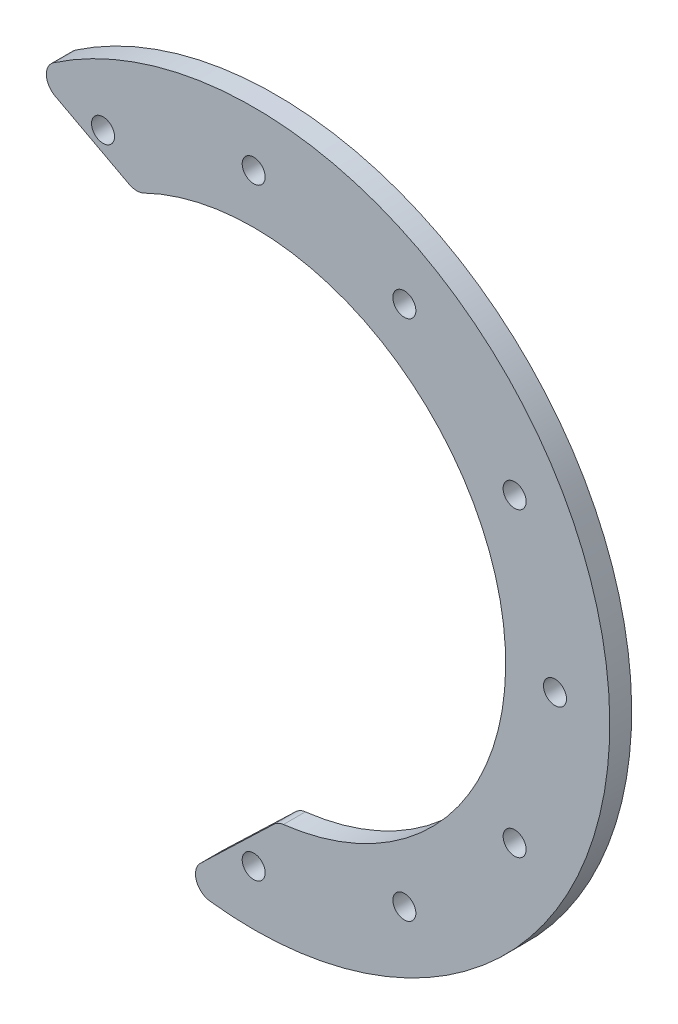
ISO-10303-21;
HEADER;
FILE_DESCRIPTION(('STEP AP214'),'2;1');
FILE_NAME('part.step','',(''),(''),'','','');
FILE_SCHEMA(('AUTOMOTIVE_DESIGN { 1 0 10303 214 1 1 1 1 }'));
ENDSEC;
DATA;
#1=APPLICATION_CONTEXT('core data for automotive mechanical design processes');
#2=APPLICATION_PROTOCOL_DEFINITION('international standard','automotive_design',2000,#1);
#3=PRODUCT_CONTEXT('',#1,'mechanical');
#4=PRODUCT('Part','Part','',(#3));
#5=PRODUCT_RELATED_PRODUCT_CATEGORY('part','',(#4));
#6=PRODUCT_DEFINITION_FORMATION('','',#4);
#7=PRODUCT_DEFINITION_CONTEXT('part definition',#1,'design');
#8=PRODUCT_DEFINITION('design','',#6,#7);
#9=PRODUCT_DEFINITION_SHAPE('','',#8);
#10=(LENGTH_UNIT() NAMED_UNIT(*) SI_UNIT(.MILLI.,.METRE.));
#11=(NAMED_UNIT(*) PLANE_ANGLE_UNIT() SI_UNIT($,.RADIAN.));
#12=(NAMED_UNIT(*) SI_UNIT($,.STERADIAN.) SOLID_ANGLE_UNIT());
#13=UNCERTAINTY_MEASURE_WITH_UNIT(LENGTH_MEASURE(1.E-05),#10,'distance_accuracy_value','');
#14=(GEOMETRIC_REPRESENTATION_CONTEXT(3) GLOBAL_UNCERTAINTY_ASSIGNED_CONTEXT((#13)) GLOBAL_UNIT_ASSIGNED_CONTEXT((#10,
#11,#12)) REPRESENTATION_CONTEXT('',''));
#15=CARTESIAN_POINT('',(0.,0.,0.));
#16=DIRECTION('',(0.,0.,1.));
#17=DIRECTION('',(1.,0.,0.));
#18=AXIS2_PLACEMENT_3D('',#15,#16,#17);
#19=CARTESIAN_POINT('',(0.,0.,4.));
#20=DIRECTION('',(0.,0.,1.));
#21=DIRECTION('',(1.,0.,0.));
#22=AXIS2_PLACEMENT_3D('',#19,#20,#21);
#23=PLANE('',#22);
#24=DIRECTION('',(0.721506911525275,0.692407233224249,0.));
#25=VECTOR('',#24,1.);
#26=CARTESIAN_POINT('',(-37.6609541251066,-86.1951963747823,4.));
#27=LINE('',#26,#25);
#28=CARTESIAN_POINT('',(-9.70289224313838,-59.3647336795849,4.));
#29=VERTEX_POINT('',#28);
#30=CARTESIAN_POINT('',(3.71033659998461,-46.4924846082118,4.));
#31=VERTEX_POINT('',#30);
#32=EDGE_CURVE('E154',#29,#31,#27,.T.);
#33=ORIENTED_EDGE('',*,*,#32,.F.);
#34=CARTESIAN_POINT('',(-7.62567054346563,-61.5292544141607,4.));
#35=DIRECTION('',(0.,0.,1.));
#36=DIRECTION('',(1.,0.,0.));
#37=AXIS2_PLACEMENT_3D('',#34,#35,#36);
#38=CIRCLE('',#37,3.);
#39=CARTESIAN_POINT('',(-7.99465460202043,-64.5064764019427,4.));
#40=VERTEX_POINT('',#39);
#41=EDGE_CURVE('E42',#29,#40,#38,.T.);
#42=ORIENTED_EDGE('',*,*,#41,.T.);
#43=CARTESIAN_POINT('',(0.,0.,4.));
#44=DIRECTION('',(0.,0.,1.));
#45=DIRECTION('',(1.,0.,0.));
#46=AXIS2_PLACEMENT_3D('',#43,#44,#45);
#47=CIRCLE('',#46,65.);
#48=CARTESIAN_POINT('',(-36.5315235416139,53.7628848531076,4.));
#49=VERTEX_POINT('',#48);
#50=EDGE_CURVE('E127',#40,#49,#47,.T.);
#51=ORIENTED_EDGE('',*,*,#50,.T.);
#52=CARTESIAN_POINT('',(-34.8454532243087,51.2815209368103,4.));
#53=DIRECTION('',(0.,0.,1.));
#54=DIRECTION('',(1.,0.,0.));
#55=AXIS2_PLACEMENT_3D('',#52,#53,#54);
#56=CIRCLE('',#55,3.);
#57=CARTESIAN_POINT('',(-36.2538679126663,48.6326781582336,4.));
#58=VERTEX_POINT('',#57);
#59=EDGE_CURVE('E118',#49,#58,#56,.T.);
#60=ORIENTED_EDGE('',*,*,#59,.T.);
#61=DIRECTION('',(-0.88294759285893,0.469471562785885,0.));
#62=VECTOR('',#61,1.);
#63=CARTESIAN_POINT('',(-40.4623789932553,50.8703831930345,4.));
#64=LINE('',#63,#62);
#65=CARTESIAN_POINT('',(-22.7567462914778,41.4561312919657,4.));
#66=VERTEX_POINT('',#65);
#67=EDGE_CURVE('E168',#66,#58,#64,.T.);
#68=ORIENTED_EDGE('',*,*,#67,.F.);
#69=CARTESIAN_POINT('',(-21.3483316031201,44.1049740705425,4.));
#70=DIRECTION('',(0.,0.,1.));
#71=DIRECTION('',(1.,0.,0.));
#72=AXIS2_PLACEMENT_3D('',#69,#70,#71);
#73=CIRCLE('',#72,3.);
#74=CARTESIAN_POINT('',(-20.041290892725,41.4046695356113,4.));
#75=VERTEX_POINT('',#74);
#76=EDGE_CURVE('E132',#66,#75,#73,.T.);
#77=ORIENTED_EDGE('',*,*,#76,.T.);
#78=CARTESIAN_POINT('',(0.,0.,4.));
#79=DIRECTION('',(0.,0.,1.));
#80=DIRECTION('',(1.,0.,0.));
#81=AXIS2_PLACEMENT_3D('',#78,#79,#80);
#82=CIRCLE('',#81,46.);
#83=CARTESIAN_POINT('',(5.43321799559669,-45.6780050156782,4.));
#84=VERTEX_POINT('',#83);
#85=EDGE_CURVE('E110',#84,#75,#82,.T.);
#86=ORIENTED_EDGE('',*,*,#85,.F.);
#87=CARTESIAN_POINT('',(5.78755829965734,-48.6570053427877,4.));
#88=DIRECTION('',(0.,0.,1.));
#89=DIRECTION('',(1.,0.,0.));
#90=AXIS2_PLACEMENT_3D('',#87,#88,#89);
#91=CIRCLE('',#90,3.);
#92=EDGE_CURVE('E49',#84,#31,#91,.T.);
#93=ORIENTED_EDGE('',*,*,#92,.T.);
#94=EDGE_LOOP('',(#33,#42,#51,#60,#68,#77,#86,#93));
#95=FACE_BOUND('',#94,.T.);
#96=CARTESIAN_POINT('',(0.,55.,4.));
#97=DIRECTION('',(0.,0.,1.));
#98=DIRECTION('',(1.,0.,0.));
#99=AXIS2_PLACEMENT_3D('',#96,#97,#98);
#100=CIRCLE('',#99,2.1);
#101=CARTESIAN_POINT('',(2.1,55.,4.));
#102=VERTEX_POINT('',#101);
#103=EDGE_CURVE('E179',#102,#102,#100,.T.);
#104=ORIENTED_EDGE('',*,*,#103,.F.);
#105=EDGE_LOOP('',(#104));
#106=FACE_BOUND('',#105,.T.);
#107=CARTESIAN_POINT('',(-27.4999999999997,47.6313972081429,4.));
#108=DIRECTION('',(0.,0.,1.));
#109=DIRECTION('',(1.,0.,0.));
#110=AXIS2_PLACEMENT_3D('',#107,#108,#109);
#111=CIRCLE('',#110,2.10000000000135);
#112=CARTESIAN_POINT('',(-25.3999999999984,47.6313972081429,4.));
#113=VERTEX_POINT('',#112);
#114=EDGE_CURVE('E175',#113,#113,#111,.T.);
#115=ORIENTED_EDGE('',*,*,#114,.F.);
#116=EDGE_LOOP('',(#115));
#117=FACE_BOUND('',#116,.T.);
#118=CARTESIAN_POINT('',(27.5000000000001,47.6313972081441,4.));
#119=DIRECTION('',(0.,0.,1.));
#120=DIRECTION('',(1.,0.,0.));
#121=AXIS2_PLACEMENT_3D('',#118,#119,#120);
#122=CIRCLE('',#121,2.1);
#123=CARTESIAN_POINT('',(29.6000000000001,47.6313972081441,4.));
#124=VERTEX_POINT('',#123);
#125=EDGE_CURVE('E203',#124,#124,#122,.T.);
#126=ORIENTED_EDGE('',*,*,#125,.F.);
#127=EDGE_LOOP('',(#126));
#128=FACE_BOUND('',#127,.T.);
#129=CARTESIAN_POINT('',(47.6313972081453,27.500000000002,4.));
#130=DIRECTION('',(0.,0.,1.));
#131=DIRECTION('',(1.,0.,0.));
#132=AXIS2_PLACEMENT_3D('',#129,#130,#131);
#133=CIRCLE('',#132,2.10000000000065);
#134=CARTESIAN_POINT('',(49.7313972081459,27.500000000002,4.));
#135=VERTEX_POINT('',#134);
#136=EDGE_CURVE('E209',#135,#135,#133,.T.);
#137=ORIENTED_EDGE('',*,*,#136,.F.);
#138=EDGE_LOOP('',(#137));
#139=FACE_BOUND('',#138,.T.);
#140=CARTESIAN_POINT('',(55.0000000000023,2.33468769191537E-12,4.));
#141=DIRECTION('',(0.,0.,1.));
#142=DIRECTION('',(1.,0.,0.));
#143=AXIS2_PLACEMENT_3D('',#140,#141,#142);
#144=CIRCLE('',#143,2.10000000000173);
#145=CARTESIAN_POINT('',(57.1000000000041,2.33468769191537E-12,4.));
#146=VERTEX_POINT('',#145);
#147=EDGE_CURVE('E215',#146,#146,#144,.T.);
#148=ORIENTED_EDGE('',*,*,#147,.F.);
#149=EDGE_LOOP('',(#148));
#150=FACE_BOUND('',#149,.T.);
#151=CARTESIAN_POINT('',(47.6313972081476,-27.499999999998,4.));
#152=DIRECTION('',(0.,0.,1.));
#153=DIRECTION('',(1.,0.,0.));
#154=AXIS2_PLACEMENT_3D('',#151,#152,#153);
#155=CIRCLE('',#154,2.10000000000301);
#156=CARTESIAN_POINT('',(49.7313972081506,-27.499999999998,4.));
#157=VERTEX_POINT('',#156);
#158=EDGE_CURVE('E192',#157,#157,#155,.T.);
#159=ORIENTED_EDGE('',*,*,#158,.F.);
#160=EDGE_LOOP('',(#159));
#161=FACE_BOUND('',#160,.T.);
#162=CARTESIAN_POINT('',(27.5000000000044,-47.6313972081429,4.));
#163=DIRECTION('',(0.,0.,1.));
#164=DIRECTION('',(1.,0.,0.));
#165=AXIS2_PLACEMENT_3D('',#162,#163,#164);
#166=CIRCLE('',#165,2.10000000000414);
#167=CARTESIAN_POINT('',(29.6000000000085,-47.6313972081429,4.));
#168=VERTEX_POINT('',#167);
#169=EDGE_CURVE('E193',#168,#168,#166,.T.);
#170=ORIENTED_EDGE('',*,*,#169,.F.);
#171=EDGE_LOOP('',(#170));
#172=FACE_BOUND('',#171,.T.);
#173=CARTESIAN_POINT('',(4.66937538383073E-12,-55.,4.));
#174=DIRECTION('',(0.,0.,1.));
#175=DIRECTION('',(1.,0.,0.));
#176=AXIS2_PLACEMENT_3D('',#173,#174,#175);
#177=CIRCLE('',#176,2.10000000000483);
#178=CARTESIAN_POINT('',(2.1000000000095,-55.,4.));
#179=VERTEX_POINT('',#178);
#180=EDGE_CURVE('E186',#179,#179,#177,.T.);
#181=ORIENTED_EDGE('',*,*,#180,.F.);
#182=EDGE_LOOP('',(#181));
#183=FACE_BOUND('',#182,.T.);
#184=ADVANCED_FACE('F34',(#95,#106,#117,#128,#139,#150,#161,#172,#183),#23,.T.);
#185=CARTESIAN_POINT('',(0.,0.,0.));
#186=DIRECTION('',(0.,0.,1.));
#187=DIRECTION('',(1.,0.,0.));
#188=AXIS2_PLACEMENT_3D('',#185,#186,#187);
#189=PLANE('',#188);
#190=CARTESIAN_POINT('',(0.,55.,0.));
#191=DIRECTION('',(0.,0.,1.));
#192=DIRECTION('',(1.,0.,0.));
#193=AXIS2_PLACEMENT_3D('',#190,#191,#192);
#194=CIRCLE('',#193,2.1);
#195=CARTESIAN_POINT('',(2.1,55.,0.));
#196=VERTEX_POINT('',#195);
#197=EDGE_CURVE('E111',#196,#196,#194,.T.);
#198=ORIENTED_EDGE('',*,*,#197,.T.);
#199=EDGE_LOOP('',(#198));
#200=FACE_BOUND('',#199,.T.);
#201=CARTESIAN_POINT('',(-27.4999999999997,47.6313972081429,0.));
#202=DIRECTION('',(0.,0.,1.));
#203=DIRECTION('',(1.,0.,0.));
#204=AXIS2_PLACEMENT_3D('',#201,#202,#203);
#205=CIRCLE('',#204,2.10000000000135);
#206=CARTESIAN_POINT('',(-25.3999999999984,47.6313972081429,0.));
#207=VERTEX_POINT('',#206);
#208=EDGE_CURVE('E183',#207,#207,#205,.T.);
#209=ORIENTED_EDGE('',*,*,#208,.T.);
#210=EDGE_LOOP('',(#209));
#211=FACE_BOUND('',#210,.T.);
#212=CARTESIAN_POINT('',(27.5000000000001,47.6313972081441,0.));
#213=DIRECTION('',(0.,0.,1.));
#214=DIRECTION('',(1.,0.,0.));
#215=AXIS2_PLACEMENT_3D('',#212,#213,#214);
#216=CIRCLE('',#215,2.1);
#217=CARTESIAN_POINT('',(29.6000000000001,47.6313972081441,0.));
#218=VERTEX_POINT('',#217);
#219=EDGE_CURVE('E182',#218,#218,#216,.T.);
#220=ORIENTED_EDGE('',*,*,#219,.T.);
#221=EDGE_LOOP('',(#220));
#222=FACE_BOUND('',#221,.T.);
#223=CARTESIAN_POINT('',(47.6313972081453,27.500000000002,0.));
#224=DIRECTION('',(0.,0.,1.));
#225=DIRECTION('',(1.,0.,0.));
#226=AXIS2_PLACEMENT_3D('',#223,#224,#225);
#227=CIRCLE('',#226,2.10000000000065);
#228=CARTESIAN_POINT('',(49.7313972081459,27.500000000002,0.));
#229=VERTEX_POINT('',#228);
#230=EDGE_CURVE('E206',#229,#229,#227,.T.);
#231=ORIENTED_EDGE('',*,*,#230,.T.);
#232=EDGE_LOOP('',(#231));
#233=FACE_BOUND('',#232,.T.);
#234=CARTESIAN_POINT('',(55.0000000000023,2.33468769191537E-12,0.));
#235=DIRECTION('',(0.,0.,1.));
#236=DIRECTION('',(1.,0.,0.));
#237=AXIS2_PLACEMENT_3D('',#234,#235,#236);
#238=CIRCLE('',#237,2.10000000000173);
#239=CARTESIAN_POINT('',(57.1000000000041,2.33468769191537E-12,0.));
#240=VERTEX_POINT('',#239);
#241=EDGE_CURVE('E212',#240,#240,#238,.T.);
#242=ORIENTED_EDGE('',*,*,#241,.T.);
#243=EDGE_LOOP('',(#242));
#244=FACE_BOUND('',#243,.T.);
#245=CARTESIAN_POINT('',(47.6313972081476,-27.499999999998,0.));
#246=DIRECTION('',(0.,0.,1.));
#247=DIRECTION('',(1.,0.,0.));
#248=AXIS2_PLACEMENT_3D('',#245,#246,#247);
#249=CIRCLE('',#248,2.10000000000301);
#250=CARTESIAN_POINT('',(49.7313972081506,-27.499999999998,0.));
#251=VERTEX_POINT('',#250);
#252=EDGE_CURVE('E218',#251,#251,#249,.T.);
#253=ORIENTED_EDGE('',*,*,#252,.T.);
#254=EDGE_LOOP('',(#253));
#255=FACE_BOUND('',#254,.T.);
#256=CARTESIAN_POINT('',(27.5000000000044,-47.6313972081429,0.));
#257=DIRECTION('',(0.,0.,1.));
#258=DIRECTION('',(1.,0.,0.));
#259=AXIS2_PLACEMENT_3D('',#256,#257,#258);
#260=CIRCLE('',#259,2.10000000000414);
#261=CARTESIAN_POINT('',(29.6000000000085,-47.6313972081429,0.));
#262=VERTEX_POINT('',#261);
#263=EDGE_CURVE('E189',#262,#262,#260,.T.);
#264=ORIENTED_EDGE('',*,*,#263,.T.);
#265=EDGE_LOOP('',(#264));
#266=FACE_BOUND('',#265,.T.);
#267=CARTESIAN_POINT('',(4.66937538383073E-12,-55.,0.));
#268=DIRECTION('',(0.,0.,1.));
#269=DIRECTION('',(1.,0.,0.));
#270=AXIS2_PLACEMENT_3D('',#267,#268,#269);
#271=CIRCLE('',#270,2.10000000000483);
#272=CARTESIAN_POINT('',(2.1000000000095,-55.,0.));
#273=VERTEX_POINT('',#272);
#274=EDGE_CURVE('E196',#273,#273,#271,.T.);
#275=ORIENTED_EDGE('',*,*,#274,.T.);
#276=EDGE_LOOP('',(#275));
#277=FACE_BOUND('',#276,.T.);
#278=CARTESIAN_POINT('',(0.,0.,0.));
#279=DIRECTION('',(0.,0.,1.));
#280=DIRECTION('',(1.,0.,0.));
#281=AXIS2_PLACEMENT_3D('',#278,#279,#280);
#282=CIRCLE('',#281,65.);
#283=CARTESIAN_POINT('',(-7.99465460202043,-64.5064764019427,0.));
#284=VERTEX_POINT('',#283);
#285=CARTESIAN_POINT('',(-36.5315235416139,53.7628848531076,0.));
#286=VERTEX_POINT('',#285);
#287=EDGE_CURVE('E161',#284,#286,#282,.T.);
#288=ORIENTED_EDGE('',*,*,#287,.F.);
#289=CARTESIAN_POINT('',(-7.62567054346563,-61.5292544141607,0.));
#290=DIRECTION('',(0.,0.,1.));
#291=DIRECTION('',(1.,0.,0.));
#292=AXIS2_PLACEMENT_3D('',#289,#290,#291);
#293=CIRCLE('',#292,3.);
#294=CARTESIAN_POINT('',(-9.70289224313838,-59.3647336795849,0.));
#295=VERTEX_POINT('',#294);
#296=EDGE_CURVE('E144',#284,#295,#293,.F.);
#297=ORIENTED_EDGE('',*,*,#296,.T.);
#298=DIRECTION('',(0.721506911525275,0.692407233224249,0.));
#299=VECTOR('',#298,1.);
#300=CARTESIAN_POINT('',(25.0053960155417,-26.0562934425568,0.));
#301=LINE('',#300,#299);
#302=CARTESIAN_POINT('',(3.7103365999846,-46.4924846082119,0.));
#303=VERTEX_POINT('',#302);
#304=EDGE_CURVE('E165',#295,#303,#301,.T.);
#305=ORIENTED_EDGE('',*,*,#304,.T.);
#306=CARTESIAN_POINT('',(5.78755829965734,-48.6570053427877,0.));
#307=DIRECTION('',(0.,0.,1.));
#308=DIRECTION('',(1.,0.,0.));
#309=AXIS2_PLACEMENT_3D('',#306,#307,#308);
#310=CIRCLE('',#309,3.);
#311=CARTESIAN_POINT('',(5.43321799559669,-45.6780050156782,0.));
#312=VERTEX_POINT('',#311);
#313=EDGE_CURVE('E108',#303,#312,#310,.F.);
#314=ORIENTED_EDGE('',*,*,#313,.T.);
#315=CARTESIAN_POINT('',(0.,0.,0.));
#316=DIRECTION('',(0.,0.,1.));
#317=DIRECTION('',(1.,0.,0.));
#318=AXIS2_PLACEMENT_3D('',#315,#316,#317);
#319=CIRCLE('',#318,46.);
#320=CARTESIAN_POINT('',(-20.041290892725,41.4046695356113,0.));
#321=VERTEX_POINT('',#320);
#322=EDGE_CURVE('E98',#312,#321,#319,.T.);
#323=ORIENTED_EDGE('',*,*,#322,.T.);
#324=CARTESIAN_POINT('',(-21.3483316031201,44.1049740705425,0.));
#325=DIRECTION('',(0.,0.,1.));
#326=DIRECTION('',(1.,0.,0.));
#327=AXIS2_PLACEMENT_3D('',#324,#325,#326);
#328=CIRCLE('',#327,3.);
#329=CARTESIAN_POINT('',(-22.7567462914778,41.4561312919657,0.));
#330=VERTEX_POINT('',#329);
#331=EDGE_CURVE('E104',#321,#330,#328,.F.);
#332=ORIENTED_EDGE('',*,*,#331,.T.);
#333=DIRECTION('',(-0.88294759285893,0.469471562785885,0.));
#334=VECTOR('',#333,1.);
#335=CARTESIAN_POINT('',(-40.4623789932553,50.8703831930345,0.));
#336=LINE('',#335,#334);
#337=CARTESIAN_POINT('',(-36.2538679126663,48.6326781582336,0.));
#338=VERTEX_POINT('',#337);
#339=EDGE_CURVE('E171',#330,#338,#336,.T.);
#340=ORIENTED_EDGE('',*,*,#339,.T.);
#341=CARTESIAN_POINT('',(-34.8454532243087,51.2815209368103,0.));
#342=DIRECTION('',(0.,0.,1.));
#343=DIRECTION('',(1.,0.,0.));
#344=AXIS2_PLACEMENT_3D('',#341,#342,#343);
#345=CIRCLE('',#344,3.);
#346=EDGE_CURVE('E124',#338,#286,#345,.F.);
#347=ORIENTED_EDGE('',*,*,#346,.T.);
#348=EDGE_LOOP('',(#288,#297,#305,#314,#323,#332,#340,#347));
#349=FACE_BOUND('',#348,.T.);
#350=ADVANCED_FACE('F101',(#200,#211,#222,#233,#244,#255,#266,#277,#349),#189,.F.);
#351=CARTESIAN_POINT('',(0.,0.,4.));
#352=DIRECTION('',(0.,0.,-1.));
#353=DIRECTION('',(-1.,0.,0.));
#354=AXIS2_PLACEMENT_3D('',#351,#352,#353);
#355=CYLINDRICAL_SURFACE('',#354,65.);
#356=ORIENTED_EDGE('',*,*,#50,.F.);
#357=DIRECTION('',(0.,0.,-1.));
#358=VECTOR('',#357,1.);
#359=CARTESIAN_POINT('',(-7.99465460202043,-64.5064764019427,4.));
#360=LINE('',#359,#358);
#361=EDGE_CURVE('E140',#40,#284,#360,.T.);
#362=ORIENTED_EDGE('',*,*,#361,.T.);
#363=ORIENTED_EDGE('',*,*,#287,.T.);
#364=DIRECTION('',(0.,0.,-1.));
#365=VECTOR('',#364,1.);
#366=CARTESIAN_POINT('',(-36.5315235416139,53.7628848531076,4.));
#367=LINE('',#366,#365);
#368=EDGE_CURVE('E134',#286,#49,#367,.F.);
#369=ORIENTED_EDGE('',*,*,#368,.T.);
#370=EDGE_LOOP('',(#356,#362,#363,#369));
#371=FACE_BOUND('',#370,.T.);
#372=ADVANCED_FACE('F159',(#371),#355,.T.);
#373=CARTESIAN_POINT('',(0.,0.,4.));
#374=DIRECTION('',(0.,0.,-1.));
#375=DIRECTION('',(-1.,0.,0.));
#376=AXIS2_PLACEMENT_3D('',#373,#374,#375);
#377=CYLINDRICAL_SURFACE('',#376,46.);
#378=ORIENTED_EDGE('',*,*,#322,.F.);
#379=DIRECTION('',(0.,0.,-1.));
#380=VECTOR('',#379,1.);
#381=CARTESIAN_POINT('',(5.43321799559669,-45.6780050156782,4.));
#382=LINE('',#381,#380);
#383=EDGE_CURVE('E11',#312,#84,#382,.F.);
#384=ORIENTED_EDGE('',*,*,#383,.T.);
#385=ORIENTED_EDGE('',*,*,#85,.T.);
#386=DIRECTION('',(0.,0.,-1.));
#387=VECTOR('',#386,1.);
#388=CARTESIAN_POINT('',(-20.041290892725,41.4046695356113,4.));
#389=LINE('',#388,#387);
#390=EDGE_CURVE('E114',#75,#321,#389,.T.);
#391=ORIENTED_EDGE('',*,*,#390,.T.);
#392=EDGE_LOOP('',(#378,#384,#385,#391));
#393=FACE_BOUND('',#392,.T.);
#394=ADVANCED_FACE('F115',(#393),#377,.F.);
#395=CARTESIAN_POINT('',(4.66937538383073E-12,-55.,0.));
#396=DIRECTION('',(0.,0.,1.));
#397=DIRECTION('',(1.,0.,0.));
#398=AXIS2_PLACEMENT_3D('',#395,#396,#397);
#399=CYLINDRICAL_SURFACE('',#398,2.10000000000483);
#400=ORIENTED_EDGE('',*,*,#274,.F.);
#401=EDGE_LOOP('',(#400));
#402=FACE_BOUND('',#401,.T.);
#403=ORIENTED_EDGE('',*,*,#180,.T.);
#404=EDGE_LOOP('',(#403));
#405=FACE_BOUND('',#404,.T.);
#406=ADVANCED_FACE('F339',(#402,#405),#399,.F.);
#407=CARTESIAN_POINT('',(27.5000000000044,-47.6313972081429,0.));
#408=DIRECTION('',(0.,0.,1.));
#409=DIRECTION('',(1.,0.,0.));
#410=AXIS2_PLACEMENT_3D('',#407,#408,#409);
#411=CYLINDRICAL_SURFACE('',#410,2.10000000000414);
#412=ORIENTED_EDGE('',*,*,#263,.F.);
#413=EDGE_LOOP('',(#412));
#414=FACE_BOUND('',#413,.T.);
#415=ORIENTED_EDGE('',*,*,#169,.T.);
#416=EDGE_LOOP('',(#415));
#417=FACE_BOUND('',#416,.T.);
#418=ADVANCED_FACE('F330',(#414,#417),#411,.F.);
#419=CARTESIAN_POINT('',(47.6313972081476,-27.499999999998,0.));
#420=DIRECTION('',(0.,0.,1.));
#421=DIRECTION('',(1.,0.,0.));
#422=AXIS2_PLACEMENT_3D('',#419,#420,#421);
#423=CYLINDRICAL_SURFACE('',#422,2.10000000000301);
#424=ORIENTED_EDGE('',*,*,#252,.F.);
#425=EDGE_LOOP('',(#424));
#426=FACE_BOUND('',#425,.T.);
#427=ORIENTED_EDGE('',*,*,#158,.T.);
#428=EDGE_LOOP('',(#427));
#429=FACE_BOUND('',#428,.T.);
#430=ADVANCED_FACE('F320',(#426,#429),#423,.F.);
#431=CARTESIAN_POINT('',(55.0000000000023,2.33468769191537E-12,0.));
#432=DIRECTION('',(0.,0.,1.));
#433=DIRECTION('',(1.,0.,0.));
#434=AXIS2_PLACEMENT_3D('',#431,#432,#433);
#435=CYLINDRICAL_SURFACE('',#434,2.10000000000173);
#436=ORIENTED_EDGE('',*,*,#241,.F.);
#437=EDGE_LOOP('',(#436));
#438=FACE_BOUND('',#437,.T.);
#439=ORIENTED_EDGE('',*,*,#147,.T.);
#440=EDGE_LOOP('',(#439));
#441=FACE_BOUND('',#440,.T.);
#442=ADVANCED_FACE('F310',(#438,#441),#435,.F.);
#443=CARTESIAN_POINT('',(47.6313972081453,27.500000000002,0.));
#444=DIRECTION('',(0.,0.,1.));
#445=DIRECTION('',(1.,0.,0.));
#446=AXIS2_PLACEMENT_3D('',#443,#444,#445);
#447=CYLINDRICAL_SURFACE('',#446,2.10000000000065);
#448=ORIENTED_EDGE('',*,*,#230,.F.);
#449=EDGE_LOOP('',(#448));
#450=FACE_BOUND('',#449,.T.);
#451=ORIENTED_EDGE('',*,*,#136,.T.);
#452=EDGE_LOOP('',(#451));
#453=FACE_BOUND('',#452,.T.);
#454=ADVANCED_FACE('F300',(#450,#453),#447,.F.);
#455=CARTESIAN_POINT('',(27.5000000000001,47.6313972081441,0.));
#456=DIRECTION('',(0.,0.,1.));
#457=DIRECTION('',(1.,0.,0.));
#458=AXIS2_PLACEMENT_3D('',#455,#456,#457);
#459=CYLINDRICAL_SURFACE('',#458,2.1);
#460=ORIENTED_EDGE('',*,*,#219,.F.);
#461=EDGE_LOOP('',(#460));
#462=FACE_BOUND('',#461,.T.);
#463=ORIENTED_EDGE('',*,*,#125,.T.);
#464=EDGE_LOOP('',(#463));
#465=FACE_BOUND('',#464,.T.);
#466=ADVANCED_FACE('F290',(#462,#465),#459,.F.);
#467=CARTESIAN_POINT('',(-27.4999999999997,47.6313972081429,0.));
#468=DIRECTION('',(0.,0.,1.));
#469=DIRECTION('',(1.,0.,0.));
#470=AXIS2_PLACEMENT_3D('',#467,#468,#469);
#471=CYLINDRICAL_SURFACE('',#470,2.10000000000135);
#472=ORIENTED_EDGE('',*,*,#208,.F.);
#473=EDGE_LOOP('',(#472));
#474=FACE_BOUND('',#473,.T.);
#475=ORIENTED_EDGE('',*,*,#114,.T.);
#476=EDGE_LOOP('',(#475));
#477=FACE_BOUND('',#476,.T.);
#478=ADVANCED_FACE('F238',(#474,#477),#471,.F.);
#479=CARTESIAN_POINT('',(0.,55.,0.));
#480=DIRECTION('',(0.,0.,1.));
#481=DIRECTION('',(1.,0.,0.));
#482=AXIS2_PLACEMENT_3D('',#479,#480,#481);
#483=CYLINDRICAL_SURFACE('',#482,2.1);
#484=ORIENTED_EDGE('',*,*,#197,.F.);
#485=EDGE_LOOP('',(#484));
#486=FACE_BOUND('',#485,.T.);
#487=ORIENTED_EDGE('',*,*,#103,.T.);
#488=EDGE_LOOP('',(#487));
#489=FACE_BOUND('',#488,.T.);
#490=ADVANCED_FACE('F231',(#486,#489),#483,.F.);
#491=CARTESIAN_POINT('',(-40.4623789932553,50.8703831930345,0.));
#492=DIRECTION('',(0.469471562785885,0.88294759285893,0.));
#493=DIRECTION('',(-0.88294759285893,0.469471562785885,0.));
#494=AXIS2_PLACEMENT_3D('',#491,#492,#493);
#495=PLANE('',#494);
#496=ORIENTED_EDGE('',*,*,#339,.F.);
#497=DIRECTION('',(0.,0.,1.));
#498=VECTOR('',#497,1.);
#499=CARTESIAN_POINT('',(-22.7567462914778,41.4561312919657,4.));
#500=LINE('',#499,#498);
#501=EDGE_CURVE('E123',#330,#66,#500,.T.);
#502=ORIENTED_EDGE('',*,*,#501,.T.);
#503=ORIENTED_EDGE('',*,*,#67,.T.);
#504=DIRECTION('',(0.,0.,-1.));
#505=VECTOR('',#504,1.);
#506=CARTESIAN_POINT('',(-36.2538679126663,48.6326781582336,0.));
#507=LINE('',#506,#505);
#508=EDGE_CURVE('E137',#58,#338,#507,.T.);
#509=ORIENTED_EDGE('',*,*,#508,.T.);
#510=EDGE_LOOP('',(#496,#502,#503,#509));
#511=FACE_BOUND('',#510,.T.);
#512=ADVANCED_FACE('F229',(#511),#495,.F.);
#513=CARTESIAN_POINT('',(-21.3483316031201,44.1049740705425,4.));
#514=DIRECTION('',(0.,0.,-1.));
#515=DIRECTION('',(-1.,0.,0.));
#516=AXIS2_PLACEMENT_3D('',#513,#514,#515);
#517=CYLINDRICAL_SURFACE('',#516,3.);
#518=ORIENTED_EDGE('',*,*,#331,.F.);
#519=ORIENTED_EDGE('',*,*,#390,.F.);
#520=ORIENTED_EDGE('',*,*,#76,.F.);
#521=ORIENTED_EDGE('',*,*,#501,.F.);
#522=EDGE_LOOP('',(#518,#519,#520,#521));
#523=FACE_BOUND('',#522,.T.);
#524=ADVANCED_FACE('F121',(#523),#517,.T.);
#525=CARTESIAN_POINT('',(-34.8454532243087,51.2815209368103,4.));
#526=DIRECTION('',(0.,0.,-1.));
#527=DIRECTION('',(-1.,0.,0.));
#528=AXIS2_PLACEMENT_3D('',#525,#526,#527);
#529=CYLINDRICAL_SURFACE('',#528,3.);
#530=ORIENTED_EDGE('',*,*,#346,.F.);
#531=ORIENTED_EDGE('',*,*,#508,.F.);
#532=ORIENTED_EDGE('',*,*,#59,.F.);
#533=ORIENTED_EDGE('',*,*,#368,.F.);
#534=EDGE_LOOP('',(#530,#531,#532,#533));
#535=FACE_BOUND('',#534,.T.);
#536=ADVANCED_FACE('F226',(#535),#529,.T.);
#537=CARTESIAN_POINT('',(-37.6609541251066,-86.1951963747823,-11.));
#538=DIRECTION('',(0.692407233224249,-0.721506911525275,0.));
#539=DIRECTION('',(0.721506911525275,0.692407233224249,0.));
#540=AXIS2_PLACEMENT_3D('',#537,#538,#539);
#541=PLANE('',#540);
#542=ORIENTED_EDGE('',*,*,#304,.F.);
#543=DIRECTION('',(0.,0.,-1.));
#544=VECTOR('',#543,1.);
#545=CARTESIAN_POINT('',(-9.70289224313838,-59.3647336795849,-11.));
#546=LINE('',#545,#544);
#547=EDGE_CURVE('E148',#295,#29,#546,.F.);
#548=ORIENTED_EDGE('',*,*,#547,.T.);
#549=ORIENTED_EDGE('',*,*,#32,.T.);
#550=DIRECTION('',(0.,0.,1.));
#551=VECTOR('',#550,1.);
#552=CARTESIAN_POINT('',(3.7103365999846,-46.4924846082119,0.));
#553=LINE('',#552,#551);
#554=EDGE_CURVE('E146',#31,#303,#553,.F.);
#555=ORIENTED_EDGE('',*,*,#554,.T.);
#556=EDGE_LOOP('',(#542,#548,#549,#555));
#557=FACE_BOUND('',#556,.T.);
#558=ADVANCED_FACE('F167',(#557),#541,.F.);
#559=CARTESIAN_POINT('',(-7.62567054346563,-61.5292544141607,4.));
#560=DIRECTION('',(0.,0.,-1.));
#561=DIRECTION('',(-1.,0.,0.));
#562=AXIS2_PLACEMENT_3D('',#559,#560,#561);
#563=CYLINDRICAL_SURFACE('',#562,3.);
#564=ORIENTED_EDGE('',*,*,#41,.F.);
#565=ORIENTED_EDGE('',*,*,#547,.F.);
#566=ORIENTED_EDGE('',*,*,#296,.F.);
#567=ORIENTED_EDGE('',*,*,#361,.F.);
#568=EDGE_LOOP('',(#564,#565,#566,#567));
#569=FACE_BOUND('',#568,.T.);
#570=ADVANCED_FACE('F163',(#569),#563,.T.);
#571=CARTESIAN_POINT('',(5.78755829965734,-48.6570053427877,4.));
#572=DIRECTION('',(0.,0.,-1.));
#573=DIRECTION('',(-1.,0.,0.));
#574=AXIS2_PLACEMENT_3D('',#571,#572,#573);
#575=CYLINDRICAL_SURFACE('',#574,3.);
#576=ORIENTED_EDGE('',*,*,#313,.F.);
#577=ORIENTED_EDGE('',*,*,#554,.F.);
#578=ORIENTED_EDGE('',*,*,#92,.F.);
#579=ORIENTED_EDGE('',*,*,#383,.F.);
#580=EDGE_LOOP('',(#576,#577,#578,#579));
#581=FACE_BOUND('',#580,.T.);
#582=ADVANCED_FACE('F36',(#581),#575,.T.);
#583=CLOSED_SHELL('',(#184,#350,#372,#394,#406,#418,#430,#442,#454,#466,#478,#490,#512,#524,
#536,#558,#570,#582));
#584=MANIFOLD_SOLID_BREP('B2',#583);
#585=ADVANCED_BREP_SHAPE_REPRESENTATION('',(#18,#584),#14);
#586=SHAPE_DEFINITION_REPRESENTATION(#9,#585);
ENDSEC;
END-ISO-10303-21;
